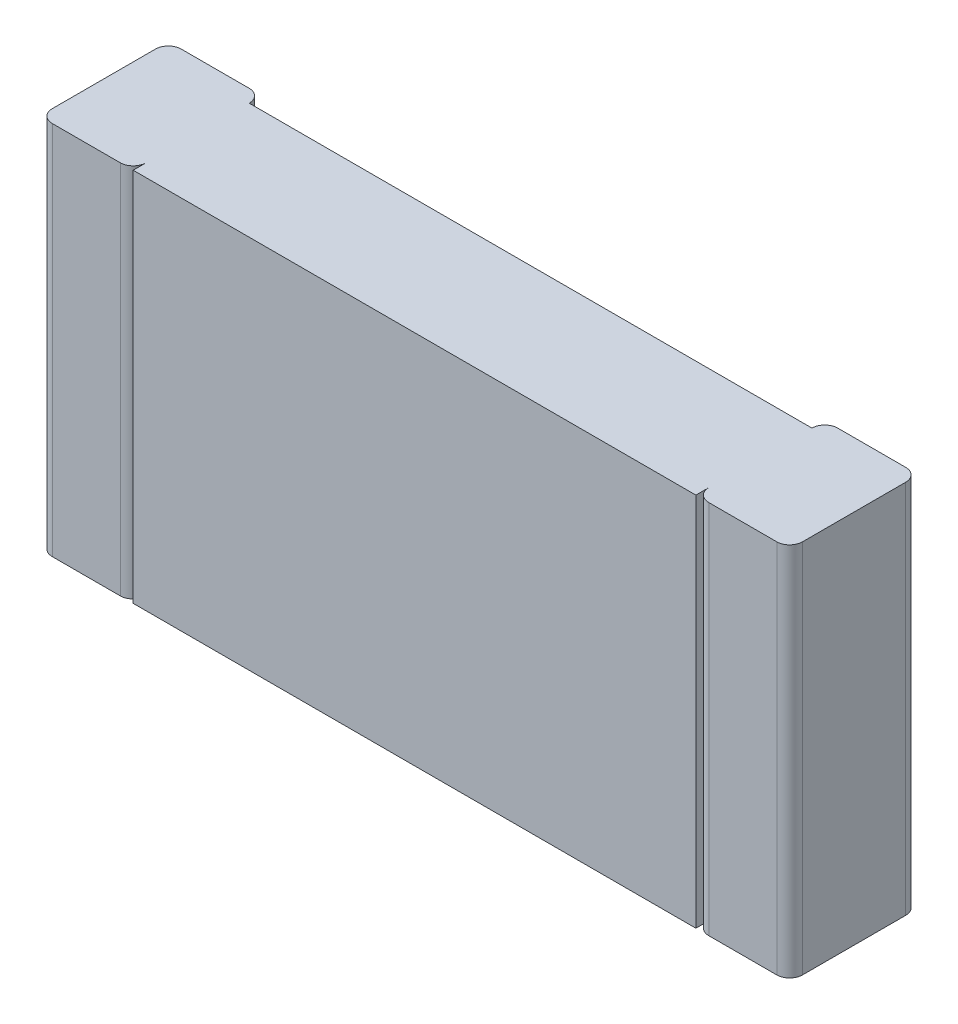
ISO-10303-21;
HEADER;
FILE_DESCRIPTION(('STEP AP214'),'2;1');
FILE_NAME('part.step','',(''),(''),'','','');
FILE_SCHEMA(('AUTOMOTIVE_DESIGN { 1 0 10303 214 1 1 1 1 }'));
ENDSEC;
DATA;
#1=APPLICATION_CONTEXT('core data for automotive mechanical design processes');
#2=APPLICATION_PROTOCOL_DEFINITION('international standard','automotive_design',2000,#1);
#3=PRODUCT_CONTEXT('',#1,'mechanical');
#4=PRODUCT('Part','Part','',(#3));
#5=PRODUCT_RELATED_PRODUCT_CATEGORY('part','',(#4));
#6=PRODUCT_DEFINITION_FORMATION('','',#4);
#7=PRODUCT_DEFINITION_CONTEXT('part definition',#1,'design');
#8=PRODUCT_DEFINITION('design','',#6,#7);
#9=PRODUCT_DEFINITION_SHAPE('','',#8);
#10=(LENGTH_UNIT() NAMED_UNIT(*) SI_UNIT(.MILLI.,.METRE.));
#11=(NAMED_UNIT(*) PLANE_ANGLE_UNIT() SI_UNIT($,.RADIAN.));
#12=(NAMED_UNIT(*) SI_UNIT($,.STERADIAN.) SOLID_ANGLE_UNIT());
#13=UNCERTAINTY_MEASURE_WITH_UNIT(LENGTH_MEASURE(1.E-05),#10,'distance_accuracy_value','');
#14=(GEOMETRIC_REPRESENTATION_CONTEXT(3) GLOBAL_UNCERTAINTY_ASSIGNED_CONTEXT((#13)) GLOBAL_UNIT_ASSIGNED_CONTEXT((#10,
#11,#12)) REPRESENTATION_CONTEXT('',''));
#15=CARTESIAN_POINT('',(0.,0.,0.));
#16=DIRECTION('',(0.,0.,1.));
#17=DIRECTION('',(1.,0.,0.));
#18=AXIS2_PLACEMENT_3D('',#15,#16,#17);
#19=CARTESIAN_POINT('',(-1.545,-0.8,0.495));
#20=DIRECTION('',(0.,1.,0.));
#21=DIRECTION('',(0.,0.,1.));
#22=AXIS2_PLACEMENT_3D('',#19,#20,#21);
#23=CYLINDRICAL_SURFACE('',#22,0.055);
#24=CARTESIAN_POINT('',(-1.545,-0.8,0.495));
#25=DIRECTION('',(0.,1.,0.));
#26=DIRECTION('',(0.,0.,1.));
#27=AXIS2_PLACEMENT_3D('',#24,#25,#26);
#28=CIRCLE('',#27,0.055);
#29=CARTESIAN_POINT('',(-1.6,-0.8,0.495));
#30=VERTEX_POINT('',#29);
#31=CARTESIAN_POINT('',(-1.545,-0.8,0.55));
#32=VERTEX_POINT('',#31);
#33=EDGE_CURVE('E148',#30,#32,#28,.T.);
#34=ORIENTED_EDGE('',*,*,#33,.T.);
#35=DIRECTION('',(0.,1.,0.));
#36=VECTOR('',#35,1.);
#37=CARTESIAN_POINT('',(-1.545,-0.8,0.55));
#38=LINE('',#37,#36);
#39=CARTESIAN_POINT('',(-1.545,0.8,0.55));
#40=VERTEX_POINT('',#39);
#41=EDGE_CURVE('E131',#40,#32,#38,.F.);
#42=ORIENTED_EDGE('',*,*,#41,.F.);
#43=CARTESIAN_POINT('',(-1.545,0.8,0.495));
#44=DIRECTION('',(0.,1.,0.));
#45=DIRECTION('',(0.,0.,1.));
#46=AXIS2_PLACEMENT_3D('',#43,#44,#45);
#47=CIRCLE('',#46,0.055);
#48=CARTESIAN_POINT('',(-1.6,0.8,0.495));
#49=VERTEX_POINT('',#48);
#50=EDGE_CURVE('E20',#40,#49,#47,.F.);
#51=ORIENTED_EDGE('',*,*,#50,.T.);
#52=DIRECTION('',(0.,1.,0.));
#53=VECTOR('',#52,1.);
#54=CARTESIAN_POINT('',(-1.6,-0.8,0.495));
#55=LINE('',#54,#53);
#56=EDGE_CURVE('E197',#49,#30,#55,.F.);
#57=ORIENTED_EDGE('',*,*,#56,.T.);
#58=EDGE_LOOP('',(#34,#42,#51,#57));
#59=FACE_BOUND('',#58,.T.);
#60=ADVANCED_FACE('F17',(#59),#23,.T.);
#61=CARTESIAN_POINT('',(1.2,-0.8,0.55));
#62=DIRECTION('',(0.,0.,1.));
#63=DIRECTION('',(1.,0.,0.));
#64=AXIS2_PLACEMENT_3D('',#61,#62,#63);
#65=PLANE('',#64);
#66=DIRECTION('',(1.,0.,0.));
#67=VECTOR('',#66,1.);
#68=CARTESIAN_POINT('',(1.2,0.8,0.55));
#69=LINE('',#68,#67);
#70=CARTESIAN_POINT('',(1.545,0.8,0.55));
#71=VERTEX_POINT('',#70);
#72=CARTESIAN_POINT('',(1.255,0.8,0.55));
#73=VERTEX_POINT('',#72);
#74=EDGE_CURVE('E199',#71,#73,#69,.F.);
#75=ORIENTED_EDGE('',*,*,#74,.T.);
#76=DIRECTION('',(0.,1.,0.));
#77=VECTOR('',#76,1.);
#78=CARTESIAN_POINT('',(1.255,-0.8,0.55));
#79=LINE('',#78,#77);
#80=CARTESIAN_POINT('',(1.255,-0.8,0.55));
#81=VERTEX_POINT('',#80);
#82=EDGE_CURVE('E191',#81,#73,#79,.T.);
#83=ORIENTED_EDGE('',*,*,#82,.F.);
#84=DIRECTION('',(1.,0.,0.));
#85=VECTOR('',#84,1.);
#86=CARTESIAN_POINT('',(1.2,-0.8,0.55));
#87=LINE('',#86,#85);
#88=CARTESIAN_POINT('',(1.545,-0.8,0.55));
#89=VERTEX_POINT('',#88);
#90=EDGE_CURVE('E198',#81,#89,#87,.T.);
#91=ORIENTED_EDGE('',*,*,#90,.T.);
#92=DIRECTION('',(0.,1.,0.));
#93=VECTOR('',#92,1.);
#94=CARTESIAN_POINT('',(1.545,-0.8,0.55));
#95=LINE('',#94,#93);
#96=EDGE_CURVE('E149',#71,#89,#95,.F.);
#97=ORIENTED_EDGE('',*,*,#96,.F.);
#98=EDGE_LOOP('',(#75,#83,#91,#97));
#99=FACE_BOUND('',#98,.T.);
#100=ADVANCED_FACE('F514',(#99),#65,.T.);
#101=CARTESIAN_POINT('',(-1.6,-0.8,0.55));
#102=DIRECTION('',(0.,0.,1.));
#103=DIRECTION('',(1.,0.,0.));
#104=AXIS2_PLACEMENT_3D('',#101,#102,#103);
#105=PLANE('',#104);
#106=DIRECTION('',(1.,0.,0.));
#107=VECTOR('',#106,1.);
#108=CARTESIAN_POINT('',(-1.6,0.8,0.55));
#109=LINE('',#108,#107);
#110=CARTESIAN_POINT('',(-1.255,0.8,0.55));
#111=VERTEX_POINT('',#110);
#112=EDGE_CURVE('E127',#111,#40,#109,.F.);
#113=ORIENTED_EDGE('',*,*,#112,.T.);
#114=ORIENTED_EDGE('',*,*,#41,.T.);
#115=DIRECTION('',(1.,0.,0.));
#116=VECTOR('',#115,1.);
#117=CARTESIAN_POINT('',(-1.6,-0.8,0.55));
#118=LINE('',#117,#116);
#119=CARTESIAN_POINT('',(-1.255,-0.8,0.55));
#120=VERTEX_POINT('',#119);
#121=EDGE_CURVE('E137',#32,#120,#118,.T.);
#122=ORIENTED_EDGE('',*,*,#121,.T.);
#123=DIRECTION('',(0.,1.,0.));
#124=VECTOR('',#123,1.);
#125=CARTESIAN_POINT('',(-1.255,-0.8,0.55));
#126=LINE('',#125,#124);
#127=EDGE_CURVE('E134',#111,#120,#126,.F.);
#128=ORIENTED_EDGE('',*,*,#127,.F.);
#129=EDGE_LOOP('',(#113,#114,#122,#128));
#130=FACE_BOUND('',#129,.T.);
#131=ADVANCED_FACE('F129',(#130),#105,.T.);
#132=CARTESIAN_POINT('',(1.545,-0.8,0.495));
#133=DIRECTION('',(0.,1.,0.));
#134=DIRECTION('',(0.,0.,1.));
#135=AXIS2_PLACEMENT_3D('',#132,#133,#134);
#136=CYLINDRICAL_SURFACE('',#135,0.055);
#137=DIRECTION('',(0.,1.,0.));
#138=VECTOR('',#137,1.);
#139=CARTESIAN_POINT('',(1.6,-0.8,0.495));
#140=LINE('',#139,#138);
#141=CARTESIAN_POINT('',(1.6,0.8,0.495));
#142=VERTEX_POINT('',#141);
#143=CARTESIAN_POINT('',(1.6,-0.8,0.495));
#144=VERTEX_POINT('',#143);
#145=EDGE_CURVE('E218',#142,#144,#140,.F.);
#146=ORIENTED_EDGE('',*,*,#145,.F.);
#147=CARTESIAN_POINT('',(1.545,0.8,0.495));
#148=DIRECTION('',(0.,1.,0.));
#149=DIRECTION('',(0.,0.,1.));
#150=AXIS2_PLACEMENT_3D('',#147,#148,#149);
#151=CIRCLE('',#150,0.055);
#152=EDGE_CURVE('E194',#142,#71,#151,.F.);
#153=ORIENTED_EDGE('',*,*,#152,.T.);
#154=ORIENTED_EDGE('',*,*,#96,.T.);
#155=CARTESIAN_POINT('',(1.545,-0.8,0.495));
#156=DIRECTION('',(0.,1.,0.));
#157=DIRECTION('',(0.,0.,1.));
#158=AXIS2_PLACEMENT_3D('',#155,#156,#157);
#159=CIRCLE('',#158,0.055);
#160=EDGE_CURVE('E152',#89,#144,#159,.T.);
#161=ORIENTED_EDGE('',*,*,#160,.T.);
#162=EDGE_LOOP('',(#146,#153,#154,#161));
#163=FACE_BOUND('',#162,.T.);
#164=ADVANCED_FACE('F496',(#163),#136,.T.);
#165=CARTESIAN_POINT('',(-1.6,-0.8,0.));
#166=DIRECTION('',(1.,0.,0.));
#167=DIRECTION('',(0.,0.,-1.));
#168=AXIS2_PLACEMENT_3D('',#165,#166,#167);
#169=PLANE('',#168);
#170=DIRECTION('',(0.,1.,0.));
#171=VECTOR('',#170,1.);
#172=CARTESIAN_POINT('',(-1.6,-0.8,0.055));
#173=LINE('',#172,#171);
#174=CARTESIAN_POINT('',(-1.6,-0.8,0.055));
#175=VERTEX_POINT('',#174);
#176=CARTESIAN_POINT('',(-1.6,0.8,0.055));
#177=VERTEX_POINT('',#176);
#178=EDGE_CURVE('E180',#175,#177,#173,.T.);
#179=ORIENTED_EDGE('',*,*,#178,.F.);
#180=DIRECTION('',(0.,0.,-1.));
#181=VECTOR('',#180,1.);
#182=CARTESIAN_POINT('',(-1.6,-0.8,0.));
#183=LINE('',#182,#181);
#184=EDGE_CURVE('E209',#30,#175,#183,.T.);
#185=ORIENTED_EDGE('',*,*,#184,.F.);
#186=ORIENTED_EDGE('',*,*,#56,.F.);
#187=DIRECTION('',(0.,0.,-1.));
#188=VECTOR('',#187,1.);
#189=CARTESIAN_POINT('',(-1.6,0.8,0.));
#190=LINE('',#189,#188);
#191=EDGE_CURVE('E144',#177,#49,#190,.F.);
#192=ORIENTED_EDGE('',*,*,#191,.F.);
#193=EDGE_LOOP('',(#179,#185,#186,#192));
#194=FACE_BOUND('',#193,.T.);
#195=ADVANCED_FACE('F486',(#194),#169,.F.);
#196=CARTESIAN_POINT('',(1.255,-0.8,0.495));
#197=DIRECTION('',(0.,1.,0.));
#198=DIRECTION('',(0.,0.,1.));
#199=AXIS2_PLACEMENT_3D('',#196,#197,#198);
#200=CYLINDRICAL_SURFACE('',#199,0.055);
#201=CARTESIAN_POINT('',(1.255,-0.8,0.495));
#202=DIRECTION('',(0.,1.,0.));
#203=DIRECTION('',(0.,0.,1.));
#204=AXIS2_PLACEMENT_3D('',#201,#202,#203);
#205=CIRCLE('',#204,0.055);
#206=CARTESIAN_POINT('',(1.2,-0.8,0.495));
#207=VERTEX_POINT('',#206);
#208=EDGE_CURVE('E189',#207,#81,#205,.T.);
#209=ORIENTED_EDGE('',*,*,#208,.T.);
#210=ORIENTED_EDGE('',*,*,#82,.T.);
#211=CARTESIAN_POINT('',(1.255,0.8,0.495));
#212=DIRECTION('',(0.,1.,0.));
#213=DIRECTION('',(0.,0.,1.));
#214=AXIS2_PLACEMENT_3D('',#211,#212,#213);
#215=CIRCLE('',#214,0.055);
#216=CARTESIAN_POINT('',(1.2,0.8,0.495));
#217=VERTEX_POINT('',#216);
#218=EDGE_CURVE('E192',#73,#217,#215,.F.);
#219=ORIENTED_EDGE('',*,*,#218,.T.);
#220=DIRECTION('',(0.,1.,0.));
#221=VECTOR('',#220,1.);
#222=CARTESIAN_POINT('',(1.2,-0.8,0.495));
#223=LINE('',#222,#221);
#224=EDGE_CURVE('E237',#207,#217,#223,.T.);
#225=ORIENTED_EDGE('',*,*,#224,.F.);
#226=EDGE_LOOP('',(#209,#210,#219,#225));
#227=FACE_BOUND('',#226,.T.);
#228=ADVANCED_FACE('F477',(#227),#200,.T.);
#229=CARTESIAN_POINT('',(-1.255,-0.8,0.495));
#230=DIRECTION('',(0.,1.,0.));
#231=DIRECTION('',(0.,0.,1.));
#232=AXIS2_PLACEMENT_3D('',#229,#230,#231);
#233=CYLINDRICAL_SURFACE('',#232,0.055);
#234=DIRECTION('',(0.,1.,0.));
#235=VECTOR('',#234,1.);
#236=CARTESIAN_POINT('',(-1.2,-0.8,0.495));
#237=LINE('',#236,#235);
#238=CARTESIAN_POINT('',(-1.2,-0.8,0.495));
#239=VERTEX_POINT('',#238);
#240=CARTESIAN_POINT('',(-1.2,0.8,0.495));
#241=VERTEX_POINT('',#240);
#242=EDGE_CURVE('E236',#239,#241,#237,.T.);
#243=ORIENTED_EDGE('',*,*,#242,.T.);
#244=CARTESIAN_POINT('',(-1.255,0.8,0.495));
#245=DIRECTION('',(0.,1.,0.));
#246=DIRECTION('',(0.,0.,1.));
#247=AXIS2_PLACEMENT_3D('',#244,#245,#246);
#248=CIRCLE('',#247,0.055);
#249=EDGE_CURVE('E184',#241,#111,#248,.F.);
#250=ORIENTED_EDGE('',*,*,#249,.T.);
#251=ORIENTED_EDGE('',*,*,#127,.T.);
#252=CARTESIAN_POINT('',(-1.255,-0.8,0.495));
#253=DIRECTION('',(0.,1.,0.));
#254=DIRECTION('',(0.,0.,1.));
#255=AXIS2_PLACEMENT_3D('',#252,#253,#254);
#256=CIRCLE('',#255,0.055);
#257=EDGE_CURVE('E187',#120,#239,#256,.T.);
#258=ORIENTED_EDGE('',*,*,#257,.T.);
#259=EDGE_LOOP('',(#243,#250,#251,#258));
#260=FACE_BOUND('',#259,.T.);
#261=ADVANCED_FACE('F224',(#260),#233,.T.);
#262=CARTESIAN_POINT('',(1.6,-0.8,0.));
#263=DIRECTION('',(1.,0.,0.));
#264=DIRECTION('',(0.,0.,-1.));
#265=AXIS2_PLACEMENT_3D('',#262,#263,#264);
#266=PLANE('',#265);
#267=DIRECTION('',(0.,0.,-1.));
#268=VECTOR('',#267,1.);
#269=CARTESIAN_POINT('',(1.6,-0.8,0.));
#270=LINE('',#269,#268);
#271=CARTESIAN_POINT('',(1.6,-0.8,0.055));
#272=VERTEX_POINT('',#271);
#273=EDGE_CURVE('E183',#144,#272,#270,.T.);
#274=ORIENTED_EDGE('',*,*,#273,.T.);
#275=DIRECTION('',(0.,1.,0.));
#276=VECTOR('',#275,1.);
#277=CARTESIAN_POINT('',(1.6,-0.8,0.055));
#278=LINE('',#277,#276);
#279=CARTESIAN_POINT('',(1.6,0.8,0.055));
#280=VERTEX_POINT('',#279);
#281=EDGE_CURVE('E173',#280,#272,#278,.F.);
#282=ORIENTED_EDGE('',*,*,#281,.F.);
#283=DIRECTION('',(0.,0.,-1.));
#284=VECTOR('',#283,1.);
#285=CARTESIAN_POINT('',(1.6,0.8,0.));
#286=LINE('',#285,#284);
#287=EDGE_CURVE('E186',#280,#142,#286,.F.);
#288=ORIENTED_EDGE('',*,*,#287,.T.);
#289=ORIENTED_EDGE('',*,*,#145,.T.);
#290=EDGE_LOOP('',(#274,#282,#288,#289));
#291=FACE_BOUND('',#290,.T.);
#292=ADVANCED_FACE('F459',(#291),#266,.T.);
#293=CARTESIAN_POINT('',(-1.545,-0.8,0.055));
#294=DIRECTION('',(0.,1.,0.));
#295=DIRECTION('',(0.,0.,1.));
#296=AXIS2_PLACEMENT_3D('',#293,#294,#295);
#297=CYLINDRICAL_SURFACE('',#296,0.055);
#298=ORIENTED_EDGE('',*,*,#178,.T.);
#299=CARTESIAN_POINT('',(-1.545,0.8,0.055));
#300=DIRECTION('',(0.,1.,0.));
#301=DIRECTION('',(0.,0.,1.));
#302=AXIS2_PLACEMENT_3D('',#299,#300,#301);
#303=CIRCLE('',#302,0.055);
#304=CARTESIAN_POINT('',(-1.545,0.8,0.));
#305=VERTEX_POINT('',#304);
#306=EDGE_CURVE('E177',#177,#305,#303,.F.);
#307=ORIENTED_EDGE('',*,*,#306,.T.);
#308=DIRECTION('',(0.,1.,0.));
#309=VECTOR('',#308,1.);
#310=CARTESIAN_POINT('',(-1.545,-0.8,0.));
#311=LINE('',#310,#309);
#312=CARTESIAN_POINT('',(-1.545,-0.8,0.));
#313=VERTEX_POINT('',#312);
#314=EDGE_CURVE('E172',#305,#313,#311,.F.);
#315=ORIENTED_EDGE('',*,*,#314,.T.);
#316=CARTESIAN_POINT('',(-1.545,-0.8,0.055));
#317=DIRECTION('',(0.,1.,0.));
#318=DIRECTION('',(0.,0.,1.));
#319=AXIS2_PLACEMENT_3D('',#316,#317,#318);
#320=CIRCLE('',#319,0.055);
#321=EDGE_CURVE('E181',#313,#175,#320,.T.);
#322=ORIENTED_EDGE('',*,*,#321,.T.);
#323=EDGE_LOOP('',(#298,#307,#315,#322));
#324=FACE_BOUND('',#323,.T.);
#325=ADVANCED_FACE('F268',(#324),#297,.T.);
#326=CARTESIAN_POINT('',(1.2,-0.8,0.495));
#327=DIRECTION('',(1.,0.,0.));
#328=DIRECTION('',(0.,0.,-1.));
#329=AXIS2_PLACEMENT_3D('',#326,#327,#328);
#330=PLANE('',#329);
#331=DIRECTION('',(0.,0.,-1.));
#332=VECTOR('',#331,1.);
#333=CARTESIAN_POINT('',(1.2,-0.8,0.495));
#334=LINE('',#333,#332);
#335=CARTESIAN_POINT('',(1.2,-0.8,0.55));
#336=VERTEX_POINT('',#335);
#337=EDGE_CURVE('E241',#336,#207,#334,.T.);
#338=ORIENTED_EDGE('',*,*,#337,.T.);
#339=ORIENTED_EDGE('',*,*,#224,.T.);
#340=DIRECTION('',(0.,0.,-1.));
#341=VECTOR('',#340,1.);
#342=CARTESIAN_POINT('',(1.2,0.8,0.495));
#343=LINE('',#342,#341);
#344=CARTESIAN_POINT('',(1.2,0.8,0.55));
#345=VERTEX_POINT('',#344);
#346=EDGE_CURVE('E179',#217,#345,#343,.F.);
#347=ORIENTED_EDGE('',*,*,#346,.T.);
#348=DIRECTION('',(0.,1.,0.));
#349=VECTOR('',#348,1.);
#350=CARTESIAN_POINT('',(1.2,-0.8,0.55));
#351=LINE('',#350,#349);
#352=EDGE_CURVE('E256',#336,#345,#351,.T.);
#353=ORIENTED_EDGE('',*,*,#352,.F.);
#354=EDGE_LOOP('',(#338,#339,#347,#353));
#355=FACE_BOUND('',#354,.T.);
#356=ADVANCED_FACE('F412',(#355),#330,.T.);
#357=CARTESIAN_POINT('',(-1.2,-0.8,0.495));
#358=DIRECTION('',(1.,0.,0.));
#359=DIRECTION('',(0.,0.,-1.));
#360=AXIS2_PLACEMENT_3D('',#357,#358,#359);
#361=PLANE('',#360);
#362=ORIENTED_EDGE('',*,*,#242,.F.);
#363=DIRECTION('',(0.,0.,-1.));
#364=VECTOR('',#363,1.);
#365=CARTESIAN_POINT('',(-1.2,-0.8,0.495));
#366=LINE('',#365,#364);
#367=CARTESIAN_POINT('',(-1.2,-0.8,0.55));
#368=VERTEX_POINT('',#367);
#369=EDGE_CURVE('E230',#368,#239,#366,.T.);
#370=ORIENTED_EDGE('',*,*,#369,.F.);
#371=DIRECTION('',(0.,1.,0.));
#372=VECTOR('',#371,1.);
#373=CARTESIAN_POINT('',(-1.2,-0.8,0.55));
#374=LINE('',#373,#372);
#375=CARTESIAN_POINT('',(-1.2,0.8,0.55));
#376=VERTEX_POINT('',#375);
#377=EDGE_CURVE('E259',#376,#368,#374,.F.);
#378=ORIENTED_EDGE('',*,*,#377,.F.);
#379=DIRECTION('',(0.,0.,-1.));
#380=VECTOR('',#379,1.);
#381=CARTESIAN_POINT('',(-1.2,0.8,0.495));
#382=LINE('',#381,#380);
#383=EDGE_CURVE('E176',#241,#376,#382,.F.);
#384=ORIENTED_EDGE('',*,*,#383,.F.);
#385=EDGE_LOOP('',(#362,#370,#378,#384));
#386=FACE_BOUND('',#385,.T.);
#387=ADVANCED_FACE('F307',(#386),#361,.F.);
#388=CARTESIAN_POINT('',(1.545,-0.8,0.055));
#389=DIRECTION('',(0.,1.,0.));
#390=DIRECTION('',(0.,0.,1.));
#391=AXIS2_PLACEMENT_3D('',#388,#389,#390);
#392=CYLINDRICAL_SURFACE('',#391,0.055);
#393=CARTESIAN_POINT('',(1.545,-0.8,0.055));
#394=DIRECTION('',(0.,1.,0.));
#395=DIRECTION('',(0.,0.,1.));
#396=AXIS2_PLACEMENT_3D('',#393,#394,#395);
#397=CIRCLE('',#396,0.055);
#398=CARTESIAN_POINT('',(1.545,-0.8,0.));
#399=VERTEX_POINT('',#398);
#400=EDGE_CURVE('E170',#272,#399,#397,.T.);
#401=ORIENTED_EDGE('',*,*,#400,.T.);
#402=DIRECTION('',(0.,1.,0.));
#403=VECTOR('',#402,1.);
#404=CARTESIAN_POINT('',(1.545,-0.8,0.));
#405=LINE('',#404,#403);
#406=CARTESIAN_POINT('',(1.545,0.8,0.));
#407=VERTEX_POINT('',#406);
#408=EDGE_CURVE('E280',#399,#407,#405,.T.);
#409=ORIENTED_EDGE('',*,*,#408,.T.);
#410=CARTESIAN_POINT('',(1.545,0.8,0.055));
#411=DIRECTION('',(0.,1.,0.));
#412=DIRECTION('',(0.,0.,1.));
#413=AXIS2_PLACEMENT_3D('',#410,#411,#412);
#414=CIRCLE('',#413,0.055);
#415=EDGE_CURVE('E174',#407,#280,#414,.F.);
#416=ORIENTED_EDGE('',*,*,#415,.T.);
#417=ORIENTED_EDGE('',*,*,#281,.T.);
#418=EDGE_LOOP('',(#401,#409,#416,#417));
#419=FACE_BOUND('',#418,.T.);
#420=ADVANCED_FACE('F338',(#419),#392,.T.);
#421=CARTESIAN_POINT('',(-1.6,-0.8,0.));
#422=DIRECTION('',(0.,0.,1.));
#423=DIRECTION('',(1.,0.,0.));
#424=AXIS2_PLACEMENT_3D('',#421,#422,#423);
#425=PLANE('',#424);
#426=ORIENTED_EDGE('',*,*,#314,.F.);
#427=DIRECTION('',(1.,0.,0.));
#428=VECTOR('',#427,1.);
#429=CARTESIAN_POINT('',(-1.545,0.8,0.));
#430=LINE('',#429,#428);
#431=CARTESIAN_POINT('',(-1.255,0.8,0.));
#432=VERTEX_POINT('',#431);
#433=EDGE_CURVE('E274',#432,#305,#430,.F.);
#434=ORIENTED_EDGE('',*,*,#433,.F.);
#435=DIRECTION('',(0.,1.,0.));
#436=VECTOR('',#435,1.);
#437=CARTESIAN_POINT('',(-1.255,-0.8,0.));
#438=LINE('',#437,#436);
#439=CARTESIAN_POINT('',(-1.255,-0.8,0.));
#440=VERTEX_POINT('',#439);
#441=EDGE_CURVE('E166',#440,#432,#438,.T.);
#442=ORIENTED_EDGE('',*,*,#441,.F.);
#443=DIRECTION('',(1.,0.,0.));
#444=VECTOR('',#443,1.);
#445=CARTESIAN_POINT('',(-1.6,-0.8,0.));
#446=LINE('',#445,#444);
#447=EDGE_CURVE('E260',#313,#440,#446,.T.);
#448=ORIENTED_EDGE('',*,*,#447,.F.);
#449=EDGE_LOOP('',(#426,#434,#442,#448));
#450=FACE_BOUND('',#449,.T.);
#451=ADVANCED_FACE('F336',(#450),#425,.F.);
#452=CARTESIAN_POINT('',(-1.2,-0.8,0.55));
#453=DIRECTION('',(0.,0.,1.));
#454=DIRECTION('',(1.,0.,0.));
#455=AXIS2_PLACEMENT_3D('',#452,#453,#454);
#456=PLANE('',#455);
#457=ORIENTED_EDGE('',*,*,#377,.T.);
#458=DIRECTION('',(1.,0.,0.));
#459=VECTOR('',#458,1.);
#460=CARTESIAN_POINT('',(-1.545,-0.8,0.55));
#461=LINE('',#460,#459);
#462=EDGE_CURVE('E165',#368,#336,#461,.T.);
#463=ORIENTED_EDGE('',*,*,#462,.T.);
#464=ORIENTED_EDGE('',*,*,#352,.T.);
#465=DIRECTION('',(1.,0.,0.));
#466=VECTOR('',#465,1.);
#467=CARTESIAN_POINT('',(-1.545,0.8,0.55));
#468=LINE('',#467,#466);
#469=EDGE_CURVE('E279',#376,#345,#468,.T.);
#470=ORIENTED_EDGE('',*,*,#469,.F.);
#471=EDGE_LOOP('',(#457,#463,#464,#470));
#472=FACE_BOUND('',#471,.T.);
#473=ADVANCED_FACE('F304',(#472),#456,.T.);
#474=CARTESIAN_POINT('',(1.2,-0.8,0.));
#475=DIRECTION('',(0.,0.,1.));
#476=DIRECTION('',(1.,0.,0.));
#477=AXIS2_PLACEMENT_3D('',#474,#475,#476);
#478=PLANE('',#477);
#479=DIRECTION('',(0.,1.,0.));
#480=VECTOR('',#479,1.);
#481=CARTESIAN_POINT('',(1.255,-0.8,0.));
#482=LINE('',#481,#480);
#483=CARTESIAN_POINT('',(1.255,0.8,0.));
#484=VERTEX_POINT('',#483);
#485=CARTESIAN_POINT('',(1.255,-0.8,0.));
#486=VERTEX_POINT('',#485);
#487=EDGE_CURVE('E161',#484,#486,#482,.F.);
#488=ORIENTED_EDGE('',*,*,#487,.F.);
#489=DIRECTION('',(1.,0.,0.));
#490=VECTOR('',#489,1.);
#491=CARTESIAN_POINT('',(-1.545,0.8,0.));
#492=LINE('',#491,#490);
#493=EDGE_CURVE('E169',#407,#484,#492,.F.);
#494=ORIENTED_EDGE('',*,*,#493,.F.);
#495=ORIENTED_EDGE('',*,*,#408,.F.);
#496=DIRECTION('',(1.,0.,0.));
#497=VECTOR('',#496,1.);
#498=CARTESIAN_POINT('',(-1.545,-0.8,0.));
#499=LINE('',#498,#497);
#500=EDGE_CURVE('E250',#399,#486,#499,.F.);
#501=ORIENTED_EDGE('',*,*,#500,.T.);
#502=EDGE_LOOP('',(#488,#494,#495,#501));
#503=FACE_BOUND('',#502,.T.);
#504=ADVANCED_FACE('F321',(#503),#478,.F.);
#505=CARTESIAN_POINT('',(-1.545,0.8,0.055));
#506=DIRECTION('',(0.,1.,0.));
#507=DIRECTION('',(0.,0.,1.));
#508=AXIS2_PLACEMENT_3D('',#505,#506,#507);
#509=PLANE('',#508);
#510=ORIENTED_EDGE('',*,*,#493,.T.);
#511=CARTESIAN_POINT('',(1.255,0.8,0.055));
#512=DIRECTION('',(0.,1.,0.));
#513=DIRECTION('',(0.,0.,1.));
#514=AXIS2_PLACEMENT_3D('',#511,#512,#513);
#515=CIRCLE('',#514,0.055);
#516=CARTESIAN_POINT('',(1.2,0.8,0.055));
#517=VERTEX_POINT('',#516);
#518=EDGE_CURVE('E156',#517,#484,#515,.F.);
#519=ORIENTED_EDGE('',*,*,#518,.F.);
#520=DIRECTION('',(1.,0.,0.));
#521=VECTOR('',#520,1.);
#522=CARTESIAN_POINT('',(-1.545,0.8,0.055));
#523=LINE('',#522,#521);
#524=CARTESIAN_POINT('',(-1.2,0.8,0.055));
#525=VERTEX_POINT('',#524);
#526=EDGE_CURVE('E159',#517,#525,#523,.F.);
#527=ORIENTED_EDGE('',*,*,#526,.T.);
#528=CARTESIAN_POINT('',(-1.255,0.8,0.055));
#529=DIRECTION('',(0.,1.,0.));
#530=DIRECTION('',(0.,0.,1.));
#531=AXIS2_PLACEMENT_3D('',#528,#529,#530);
#532=CIRCLE('',#531,0.055);
#533=EDGE_CURVE('E167',#432,#525,#532,.F.);
#534=ORIENTED_EDGE('',*,*,#533,.F.);
#535=ORIENTED_EDGE('',*,*,#433,.T.);
#536=ORIENTED_EDGE('',*,*,#306,.F.);
#537=ORIENTED_EDGE('',*,*,#191,.T.);
#538=ORIENTED_EDGE('',*,*,#50,.F.);
#539=ORIENTED_EDGE('',*,*,#112,.F.);
#540=ORIENTED_EDGE('',*,*,#249,.F.);
#541=ORIENTED_EDGE('',*,*,#383,.T.);
#542=ORIENTED_EDGE('',*,*,#469,.T.);
#543=ORIENTED_EDGE('',*,*,#346,.F.);
#544=ORIENTED_EDGE('',*,*,#218,.F.);
#545=ORIENTED_EDGE('',*,*,#74,.F.);
#546=ORIENTED_EDGE('',*,*,#152,.F.);
#547=ORIENTED_EDGE('',*,*,#287,.F.);
#548=ORIENTED_EDGE('',*,*,#415,.F.);
#549=EDGE_LOOP('',(#510,#519,#527,#534,#535,#536,#537,#538,#539,#540,#541,#542,#543,#544,#545,
#546,#547,#548));
#550=FACE_BOUND('',#549,.T.);
#551=ADVANCED_FACE('F142',(#550),#509,.T.);
#552=CARTESIAN_POINT('',(-1.255,-0.8,0.055));
#553=DIRECTION('',(0.,1.,0.));
#554=DIRECTION('',(0.,0.,1.));
#555=AXIS2_PLACEMENT_3D('',#552,#553,#554);
#556=CYLINDRICAL_SURFACE('',#555,0.055);
#557=CARTESIAN_POINT('',(-1.255,-0.8,0.055));
#558=DIRECTION('',(0.,1.,0.));
#559=DIRECTION('',(0.,0.,1.));
#560=AXIS2_PLACEMENT_3D('',#557,#558,#559);
#561=CIRCLE('',#560,0.055);
#562=CARTESIAN_POINT('',(-1.2,-0.8,0.055));
#563=VERTEX_POINT('',#562);
#564=EDGE_CURVE('E162',#563,#440,#561,.T.);
#565=ORIENTED_EDGE('',*,*,#564,.T.);
#566=ORIENTED_EDGE('',*,*,#441,.T.);
#567=ORIENTED_EDGE('',*,*,#533,.T.);
#568=DIRECTION('',(0.,1.,0.));
#569=VECTOR('',#568,1.);
#570=CARTESIAN_POINT('',(-1.2,-0.8,0.055));
#571=LINE('',#570,#569);
#572=EDGE_CURVE('E329',#525,#563,#571,.F.);
#573=ORIENTED_EDGE('',*,*,#572,.T.);
#574=EDGE_LOOP('',(#565,#566,#567,#573));
#575=FACE_BOUND('',#574,.T.);
#576=ADVANCED_FACE('F334',(#575),#556,.T.);
#577=CARTESIAN_POINT('',(-1.545,-0.8,0.055));
#578=DIRECTION('',(0.,1.,0.));
#579=DIRECTION('',(0.,0.,1.));
#580=AXIS2_PLACEMENT_3D('',#577,#578,#579);
#581=PLANE('',#580);
#582=CARTESIAN_POINT('',(1.255,-0.8,0.055));
#583=DIRECTION('',(0.,1.,0.));
#584=DIRECTION('',(0.,0.,1.));
#585=AXIS2_PLACEMENT_3D('',#582,#583,#584);
#586=CIRCLE('',#585,0.055);
#587=CARTESIAN_POINT('',(1.2,-0.8,0.055));
#588=VERTEX_POINT('',#587);
#589=EDGE_CURVE('E34',#486,#588,#586,.T.);
#590=ORIENTED_EDGE('',*,*,#589,.F.);
#591=ORIENTED_EDGE('',*,*,#500,.F.);
#592=ORIENTED_EDGE('',*,*,#400,.F.);
#593=ORIENTED_EDGE('',*,*,#273,.F.);
#594=ORIENTED_EDGE('',*,*,#160,.F.);
#595=ORIENTED_EDGE('',*,*,#90,.F.);
#596=ORIENTED_EDGE('',*,*,#208,.F.);
#597=ORIENTED_EDGE('',*,*,#337,.F.);
#598=ORIENTED_EDGE('',*,*,#462,.F.);
#599=ORIENTED_EDGE('',*,*,#369,.T.);
#600=ORIENTED_EDGE('',*,*,#257,.F.);
#601=ORIENTED_EDGE('',*,*,#121,.F.);
#602=ORIENTED_EDGE('',*,*,#33,.F.);
#603=ORIENTED_EDGE('',*,*,#184,.T.);
#604=ORIENTED_EDGE('',*,*,#321,.F.);
#605=ORIENTED_EDGE('',*,*,#447,.T.);
#606=ORIENTED_EDGE('',*,*,#564,.F.);
#607=DIRECTION('',(1.,0.,0.));
#608=VECTOR('',#607,1.);
#609=CARTESIAN_POINT('',(-1.545,-0.8,0.055));
#610=LINE('',#609,#608);
#611=EDGE_CURVE('E26',#563,#588,#610,.T.);
#612=ORIENTED_EDGE('',*,*,#611,.T.);
#613=EDGE_LOOP('',(#590,#591,#592,#593,#594,#595,#596,#597,#598,#599,#600,#601,#602,#603,#604,
#605,#606,#612));
#614=FACE_BOUND('',#613,.T.);
#615=ADVANCED_FACE('F227',(#614),#581,.F.);
#616=CARTESIAN_POINT('',(1.255,-0.8,0.055));
#617=DIRECTION('',(0.,1.,0.));
#618=DIRECTION('',(0.,0.,1.));
#619=AXIS2_PLACEMENT_3D('',#616,#617,#618);
#620=CYLINDRICAL_SURFACE('',#619,0.055);
#621=DIRECTION('',(0.,1.,0.));
#622=VECTOR('',#621,1.);
#623=CARTESIAN_POINT('',(1.2,-0.8,0.055));
#624=LINE('',#623,#622);
#625=EDGE_CURVE('E11',#588,#517,#624,.T.);
#626=ORIENTED_EDGE('',*,*,#625,.T.);
#627=ORIENTED_EDGE('',*,*,#518,.T.);
#628=ORIENTED_EDGE('',*,*,#487,.T.);
#629=ORIENTED_EDGE('',*,*,#589,.T.);
#630=EDGE_LOOP('',(#626,#627,#628,#629));
#631=FACE_BOUND('',#630,.T.);
#632=ADVANCED_FACE('F317',(#631),#620,.T.);
#633=CARTESIAN_POINT('',(-1.545,-0.8,0.055));
#634=DIRECTION('',(0.,0.,1.));
#635=DIRECTION('',(1.,0.,0.));
#636=AXIS2_PLACEMENT_3D('',#633,#634,#635);
#637=PLANE('',#636);
#638=ORIENTED_EDGE('',*,*,#611,.F.);
#639=ORIENTED_EDGE('',*,*,#572,.F.);
#640=ORIENTED_EDGE('',*,*,#526,.F.);
#641=ORIENTED_EDGE('',*,*,#625,.F.);
#642=EDGE_LOOP('',(#638,#639,#640,#641));
#643=FACE_BOUND('',#642,.T.);
#644=ADVANCED_FACE('F332',(#643),#637,.F.);
#645=CLOSED_SHELL('',(#60,#100,#131,#164,#195,#228,#261,#292,#325,#356,#387,#420,#451,#473,#504,
#551,#576,#615,#632,#644));
#646=MANIFOLD_SOLID_BREP('B1',#645);
#647=ADVANCED_BREP_SHAPE_REPRESENTATION('',(#18,#646),#14);
#648=SHAPE_DEFINITION_REPRESENTATION(#9,#647);
ENDSEC;
END-ISO-10303-21;
